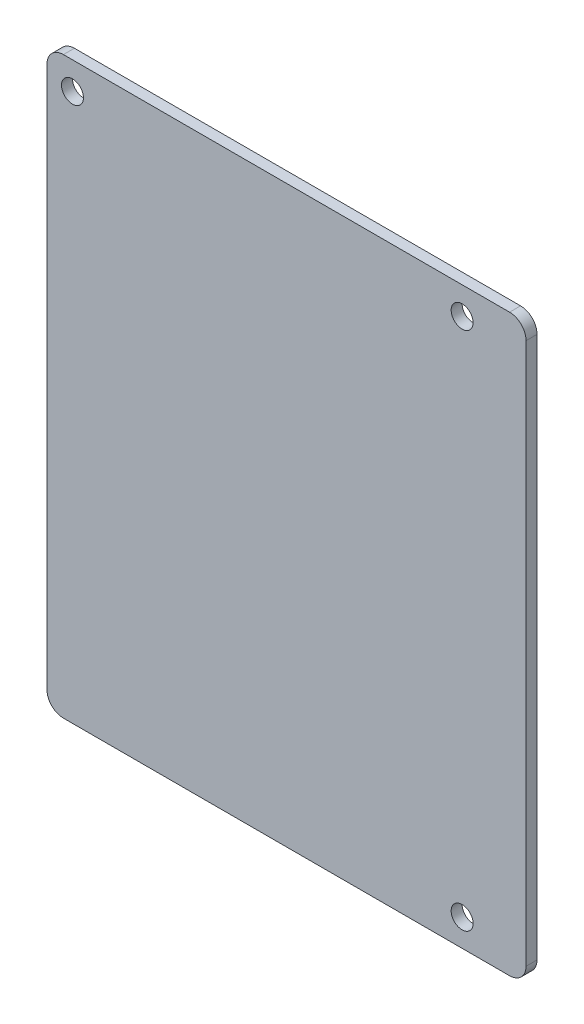
ISO-10303-21;
HEADER;
FILE_DESCRIPTION(('STEP AP214'),'2;1');
FILE_NAME('part.step','',(''),(''),'','','');
FILE_SCHEMA(('AUTOMOTIVE_DESIGN { 1 0 10303 214 1 1 1 1 }'));
ENDSEC;
DATA;
#1=APPLICATION_CONTEXT('core data for automotive mechanical design processes');
#2=APPLICATION_PROTOCOL_DEFINITION('international standard','automotive_design',2000,#1);
#3=PRODUCT_CONTEXT('',#1,'mechanical');
#4=PRODUCT('Part','Part','',(#3));
#5=PRODUCT_RELATED_PRODUCT_CATEGORY('part','',(#4));
#6=PRODUCT_DEFINITION_FORMATION('','',#4);
#7=PRODUCT_DEFINITION_CONTEXT('part definition',#1,'design');
#8=PRODUCT_DEFINITION('design','',#6,#7);
#9=PRODUCT_DEFINITION_SHAPE('','',#8);
#10=(LENGTH_UNIT() NAMED_UNIT(*) SI_UNIT(.MILLI.,.METRE.));
#11=(NAMED_UNIT(*) PLANE_ANGLE_UNIT() SI_UNIT($,.RADIAN.));
#12=(NAMED_UNIT(*) SI_UNIT($,.STERADIAN.) SOLID_ANGLE_UNIT());
#13=UNCERTAINTY_MEASURE_WITH_UNIT(LENGTH_MEASURE(1.E-05),#10,'distance_accuracy_value','');
#14=(GEOMETRIC_REPRESENTATION_CONTEXT(3) GLOBAL_UNCERTAINTY_ASSIGNED_CONTEXT((#13)) GLOBAL_UNIT_ASSIGNED_CONTEXT((#10,
#11,#12)) REPRESENTATION_CONTEXT('',''));
#15=CARTESIAN_POINT('',(0.,0.,0.));
#16=DIRECTION('',(0.,0.,1.));
#17=DIRECTION('',(1.,0.,0.));
#18=AXIS2_PLACEMENT_3D('',#15,#16,#17);
#19=CARTESIAN_POINT('',(-40.65,-49.36,2.));
#20=DIRECTION('',(0.,0.,-1.));
#21=DIRECTION('',(-1.,0.,0.));
#22=AXIS2_PLACEMENT_3D('',#19,#20,#21);
#23=CYLINDRICAL_SURFACE('',#22,3.);
#24=CARTESIAN_POINT('',(-40.65,-49.36,0.));
#25=DIRECTION('',(0.,0.,1.));
#26=DIRECTION('',(-1.,0.,0.));
#27=AXIS2_PLACEMENT_3D('',#24,#25,#26);
#28=CIRCLE('',#27,3.);
#29=CARTESIAN_POINT('',(-43.65,-49.36,0.));
#30=VERTEX_POINT('',#29);
#31=CARTESIAN_POINT('',(-40.65,-52.36,0.));
#32=VERTEX_POINT('',#31);
#33=EDGE_CURVE('E135',#30,#32,#28,.T.);
#34=ORIENTED_EDGE('',*,*,#33,.T.);
#35=DIRECTION('',(0.,0.,-1.));
#36=VECTOR('',#35,1.);
#37=CARTESIAN_POINT('',(-40.65,-52.36,2.));
#38=LINE('',#37,#36);
#39=CARTESIAN_POINT('',(-40.65,-52.36,2.));
#40=VERTEX_POINT('',#39);
#41=EDGE_CURVE('E11',#40,#32,#38,.T.);
#42=ORIENTED_EDGE('',*,*,#41,.F.);
#43=CARTESIAN_POINT('',(-40.65,-49.36,2.));
#44=DIRECTION('',(0.,0.,1.));
#45=DIRECTION('',(-1.,0.,0.));
#46=AXIS2_PLACEMENT_3D('',#43,#44,#45);
#47=CIRCLE('',#46,3.);
#48=CARTESIAN_POINT('',(-43.65,-49.36,2.));
#49=VERTEX_POINT('',#48);
#50=EDGE_CURVE('E150',#49,#40,#47,.T.);
#51=ORIENTED_EDGE('',*,*,#50,.F.);
#52=DIRECTION('',(0.,0.,-1.));
#53=VECTOR('',#52,1.);
#54=CARTESIAN_POINT('',(-43.65,-49.36,2.));
#55=LINE('',#54,#53);
#56=EDGE_CURVE('E131',#49,#30,#55,.T.);
#57=ORIENTED_EDGE('',*,*,#56,.T.);
#58=EDGE_LOOP('',(#34,#42,#51,#57));
#59=FACE_BOUND('',#58,.T.);
#60=ADVANCED_FACE('F39',(#59),#23,.T.);
#61=CARTESIAN_POINT('',(-40.65,-52.36,2.));
#62=DIRECTION('',(0.,1.,0.));
#63=DIRECTION('',(0.,0.,1.));
#64=AXIS2_PLACEMENT_3D('',#61,#62,#63);
#65=PLANE('',#64);
#66=DIRECTION('',(1.,0.,0.));
#67=VECTOR('',#66,1.);
#68=CARTESIAN_POINT('',(-40.65,-52.36,0.));
#69=LINE('',#68,#67);
#70=CARTESIAN_POINT('',(40.65,-52.36,0.));
#71=VERTEX_POINT('',#70);
#72=EDGE_CURVE('E138',#32,#71,#69,.T.);
#73=ORIENTED_EDGE('',*,*,#72,.T.);
#74=DIRECTION('',(0.,0.,-1.));
#75=VECTOR('',#74,1.);
#76=CARTESIAN_POINT('',(40.65,-52.36,2.));
#77=LINE('',#76,#75);
#78=CARTESIAN_POINT('',(40.65,-52.36,2.));
#79=VERTEX_POINT('',#78);
#80=EDGE_CURVE('E47',#79,#71,#77,.T.);
#81=ORIENTED_EDGE('',*,*,#80,.F.);
#82=DIRECTION('',(1.,0.,0.));
#83=VECTOR('',#82,1.);
#84=CARTESIAN_POINT('',(-40.65,-52.36,2.));
#85=LINE('',#84,#83);
#86=EDGE_CURVE('E98',#40,#79,#85,.T.);
#87=ORIENTED_EDGE('',*,*,#86,.F.);
#88=ORIENTED_EDGE('',*,*,#41,.T.);
#89=EDGE_LOOP('',(#73,#81,#87,#88));
#90=FACE_BOUND('',#89,.T.);
#91=ADVANCED_FACE('F226',(#90),#65,.F.);
#92=CARTESIAN_POINT('',(40.65,-49.36,2.));
#93=DIRECTION('',(0.,0.,-1.));
#94=DIRECTION('',(-1.,0.,0.));
#95=AXIS2_PLACEMENT_3D('',#92,#93,#94);
#96=CYLINDRICAL_SURFACE('',#95,3.00000000000001);
#97=CARTESIAN_POINT('',(40.65,-49.36,0.));
#98=DIRECTION('',(0.,0.,1.));
#99=DIRECTION('',(-1.,0.,0.));
#100=AXIS2_PLACEMENT_3D('',#97,#98,#99);
#101=CIRCLE('',#100,3.00000000000001);
#102=CARTESIAN_POINT('',(43.65,-49.36,0.));
#103=VERTEX_POINT('',#102);
#104=EDGE_CURVE('E141',#71,#103,#101,.T.);
#105=ORIENTED_EDGE('',*,*,#104,.T.);
#106=DIRECTION('',(0.,0.,-1.));
#107=VECTOR('',#106,1.);
#108=CARTESIAN_POINT('',(43.65,-49.36,2.));
#109=LINE('',#108,#107);
#110=CARTESIAN_POINT('',(43.65,-49.36,2.));
#111=VERTEX_POINT('',#110);
#112=EDGE_CURVE('E157',#111,#103,#109,.T.);
#113=ORIENTED_EDGE('',*,*,#112,.F.);
#114=CARTESIAN_POINT('',(40.65,-49.36,2.));
#115=DIRECTION('',(0.,0.,1.));
#116=DIRECTION('',(-1.,0.,0.));
#117=AXIS2_PLACEMENT_3D('',#114,#115,#116);
#118=CIRCLE('',#117,3.00000000000001);
#119=EDGE_CURVE('E165',#79,#111,#118,.T.);
#120=ORIENTED_EDGE('',*,*,#119,.F.);
#121=ORIENTED_EDGE('',*,*,#80,.T.);
#122=EDGE_LOOP('',(#105,#113,#120,#121));
#123=FACE_BOUND('',#122,.T.);
#124=ADVANCED_FACE('F163',(#123),#96,.T.);
#125=CARTESIAN_POINT('',(43.65,49.36,2.));
#126=DIRECTION('',(-1.,0.,0.));
#127=DIRECTION('',(0.,-1.,0.));
#128=AXIS2_PLACEMENT_3D('',#125,#126,#127);
#129=PLANE('',#128);
#130=DIRECTION('',(0.,1.,0.));
#131=VECTOR('',#130,1.);
#132=CARTESIAN_POINT('',(43.65,49.36,0.));
#133=LINE('',#132,#131);
#134=CARTESIAN_POINT('',(43.65,49.36,0.));
#135=VERTEX_POINT('',#134);
#136=EDGE_CURVE('E143',#103,#135,#133,.T.);
#137=ORIENTED_EDGE('',*,*,#136,.T.);
#138=DIRECTION('',(0.,0.,-1.));
#139=VECTOR('',#138,1.);
#140=CARTESIAN_POINT('',(43.65,49.36,2.));
#141=LINE('',#140,#139);
#142=CARTESIAN_POINT('',(43.65,49.36,2.));
#143=VERTEX_POINT('',#142);
#144=EDGE_CURVE('E154',#143,#135,#141,.T.);
#145=ORIENTED_EDGE('',*,*,#144,.F.);
#146=DIRECTION('',(0.,1.,0.));
#147=VECTOR('',#146,1.);
#148=CARTESIAN_POINT('',(43.65,49.36,2.));
#149=LINE('',#148,#147);
#150=EDGE_CURVE('E177',#111,#143,#149,.T.);
#151=ORIENTED_EDGE('',*,*,#150,.F.);
#152=ORIENTED_EDGE('',*,*,#112,.T.);
#153=EDGE_LOOP('',(#137,#145,#151,#152));
#154=FACE_BOUND('',#153,.T.);
#155=ADVANCED_FACE('F173',(#154),#129,.F.);
#156=CARTESIAN_POINT('',(40.65,49.36,2.));
#157=DIRECTION('',(0.,0.,-1.));
#158=DIRECTION('',(-1.,0.,0.));
#159=AXIS2_PLACEMENT_3D('',#156,#157,#158);
#160=CYLINDRICAL_SURFACE('',#159,3.);
#161=CARTESIAN_POINT('',(40.65,49.36,0.));
#162=DIRECTION('',(0.,0.,1.));
#163=DIRECTION('',(-1.,0.,0.));
#164=AXIS2_PLACEMENT_3D('',#161,#162,#163);
#165=CIRCLE('',#164,3.);
#166=CARTESIAN_POINT('',(40.65,52.36,0.));
#167=VERTEX_POINT('',#166);
#168=EDGE_CURVE('E145',#135,#167,#165,.T.);
#169=ORIENTED_EDGE('',*,*,#168,.T.);
#170=DIRECTION('',(0.,0.,-1.));
#171=VECTOR('',#170,1.);
#172=CARTESIAN_POINT('',(40.65,52.36,2.));
#173=LINE('',#172,#171);
#174=CARTESIAN_POINT('',(40.65,52.36,2.));
#175=VERTEX_POINT('',#174);
#176=EDGE_CURVE('E126',#175,#167,#173,.T.);
#177=ORIENTED_EDGE('',*,*,#176,.F.);
#178=CARTESIAN_POINT('',(40.65,49.36,2.));
#179=DIRECTION('',(0.,0.,1.));
#180=DIRECTION('',(-1.,0.,0.));
#181=AXIS2_PLACEMENT_3D('',#178,#179,#180);
#182=CIRCLE('',#181,3.);
#183=EDGE_CURVE('E117',#143,#175,#182,.T.);
#184=ORIENTED_EDGE('',*,*,#183,.F.);
#185=ORIENTED_EDGE('',*,*,#144,.T.);
#186=EDGE_LOOP('',(#169,#177,#184,#185));
#187=FACE_BOUND('',#186,.T.);
#188=ADVANCED_FACE('F176',(#187),#160,.T.);
#189=CARTESIAN_POINT('',(-40.65,52.36,2.));
#190=DIRECTION('',(0.,-1.,0.));
#191=DIRECTION('',(0.,0.,-1.));
#192=AXIS2_PLACEMENT_3D('',#189,#190,#191);
#193=PLANE('',#192);
#194=DIRECTION('',(-1.,0.,0.));
#195=VECTOR('',#194,1.);
#196=CARTESIAN_POINT('',(-40.65,52.36,0.));
#197=LINE('',#196,#195);
#198=CARTESIAN_POINT('',(-40.65,52.36,0.));
#199=VERTEX_POINT('',#198);
#200=EDGE_CURVE('E125',#167,#199,#197,.T.);
#201=ORIENTED_EDGE('',*,*,#200,.T.);
#202=DIRECTION('',(0.,0.,-1.));
#203=VECTOR('',#202,1.);
#204=CARTESIAN_POINT('',(-40.65,52.36,2.));
#205=LINE('',#204,#203);
#206=CARTESIAN_POINT('',(-40.65,52.36,2.));
#207=VERTEX_POINT('',#206);
#208=EDGE_CURVE('E122',#207,#199,#205,.T.);
#209=ORIENTED_EDGE('',*,*,#208,.F.);
#210=DIRECTION('',(-1.,0.,0.));
#211=VECTOR('',#210,1.);
#212=CARTESIAN_POINT('',(-40.65,52.36,2.));
#213=LINE('',#212,#211);
#214=EDGE_CURVE('E111',#175,#207,#213,.T.);
#215=ORIENTED_EDGE('',*,*,#214,.F.);
#216=ORIENTED_EDGE('',*,*,#176,.T.);
#217=EDGE_LOOP('',(#201,#209,#215,#216));
#218=FACE_BOUND('',#217,.T.);
#219=ADVANCED_FACE('F123',(#218),#193,.F.);
#220=CARTESIAN_POINT('',(-40.65,49.36,2.));
#221=DIRECTION('',(0.,0.,-1.));
#222=DIRECTION('',(-1.,0.,0.));
#223=AXIS2_PLACEMENT_3D('',#220,#221,#222);
#224=CYLINDRICAL_SURFACE('',#223,3.);
#225=CARTESIAN_POINT('',(-40.65,49.36,0.));
#226=DIRECTION('',(0.,0.,1.));
#227=DIRECTION('',(1.,0.,0.));
#228=AXIS2_PLACEMENT_3D('',#225,#226,#227);
#229=CIRCLE('',#228,3.);
#230=CARTESIAN_POINT('',(-43.65,49.36,0.));
#231=VERTEX_POINT('',#230);
#232=EDGE_CURVE('E84',#199,#231,#229,.T.);
#233=ORIENTED_EDGE('',*,*,#232,.T.);
#234=DIRECTION('',(0.,0.,-1.));
#235=VECTOR('',#234,1.);
#236=CARTESIAN_POINT('',(-43.65,49.36,2.));
#237=LINE('',#236,#235);
#238=CARTESIAN_POINT('',(-43.65,49.36,2.));
#239=VERTEX_POINT('',#238);
#240=EDGE_CURVE('E127',#239,#231,#237,.T.);
#241=ORIENTED_EDGE('',*,*,#240,.F.);
#242=CARTESIAN_POINT('',(-40.65,49.36,2.));
#243=DIRECTION('',(0.,0.,1.));
#244=DIRECTION('',(1.,0.,0.));
#245=AXIS2_PLACEMENT_3D('',#242,#243,#244);
#246=CIRCLE('',#245,3.);
#247=EDGE_CURVE('E115',#207,#239,#246,.T.);
#248=ORIENTED_EDGE('',*,*,#247,.F.);
#249=ORIENTED_EDGE('',*,*,#208,.T.);
#250=EDGE_LOOP('',(#233,#241,#248,#249));
#251=FACE_BOUND('',#250,.T.);
#252=ADVANCED_FACE('F129',(#251),#224,.T.);
#253=CARTESIAN_POINT('',(-43.65,49.36,2.));
#254=DIRECTION('',(1.,0.,0.));
#255=DIRECTION('',(0.,1.,0.));
#256=AXIS2_PLACEMENT_3D('',#253,#254,#255);
#257=PLANE('',#256);
#258=DIRECTION('',(0.,-1.,0.));
#259=VECTOR('',#258,1.);
#260=CARTESIAN_POINT('',(-43.65,49.36,0.));
#261=LINE('',#260,#259);
#262=EDGE_CURVE('E90',#231,#30,#261,.T.);
#263=ORIENTED_EDGE('',*,*,#262,.T.);
#264=ORIENTED_EDGE('',*,*,#56,.F.);
#265=DIRECTION('',(0.,-1.,0.));
#266=VECTOR('',#265,1.);
#267=CARTESIAN_POINT('',(-43.65,49.36,2.));
#268=LINE('',#267,#266);
#269=EDGE_CURVE('E55',#239,#49,#268,.T.);
#270=ORIENTED_EDGE('',*,*,#269,.F.);
#271=ORIENTED_EDGE('',*,*,#240,.T.);
#272=EDGE_LOOP('',(#263,#264,#270,#271));
#273=FACE_BOUND('',#272,.T.);
#274=ADVANCED_FACE('F205',(#273),#257,.F.);
#275=CARTESIAN_POINT('',(-40.65,-49.36,2.));
#276=DIRECTION('',(0.,0.,-1.));
#277=DIRECTION('',(-1.,0.,0.));
#278=AXIS2_PLACEMENT_3D('',#275,#276,#277);
#279=PLANE('',#278);
#280=CARTESIAN_POINT('',(-39.,47.36,2.));
#281=DIRECTION('',(0.,0.,1.));
#282=DIRECTION('',(1.,0.,0.));
#283=AXIS2_PLACEMENT_3D('',#280,#281,#282);
#284=CIRCLE('',#283,1.99999999999999);
#285=CARTESIAN_POINT('',(-37.,47.36,2.));
#286=VERTEX_POINT('',#285);
#287=EDGE_CURVE('E197',#286,#286,#284,.T.);
#288=ORIENTED_EDGE('',*,*,#287,.F.);
#289=EDGE_LOOP('',(#288));
#290=FACE_BOUND('',#289,.T.);
#291=CARTESIAN_POINT('',(32.,47.36,2.));
#292=DIRECTION('',(0.,0.,1.));
#293=DIRECTION('',(1.,0.,0.));
#294=AXIS2_PLACEMENT_3D('',#291,#292,#293);
#295=CIRCLE('',#294,1.99999999999999);
#296=CARTESIAN_POINT('',(34.,47.36,2.));
#297=VERTEX_POINT('',#296);
#298=EDGE_CURVE('E191',#297,#297,#295,.T.);
#299=ORIENTED_EDGE('',*,*,#298,.F.);
#300=EDGE_LOOP('',(#299));
#301=FACE_BOUND('',#300,.T.);
#302=CARTESIAN_POINT('',(32.,-47.44,2.));
#303=DIRECTION('',(0.,0.,1.));
#304=DIRECTION('',(1.,0.,0.));
#305=AXIS2_PLACEMENT_3D('',#302,#303,#304);
#306=CIRCLE('',#305,1.99999999999999);
#307=CARTESIAN_POINT('',(34.,-47.44,2.));
#308=VERTEX_POINT('',#307);
#309=EDGE_CURVE('E185',#308,#308,#306,.T.);
#310=ORIENTED_EDGE('',*,*,#309,.F.);
#311=EDGE_LOOP('',(#310));
#312=FACE_BOUND('',#311,.T.);
#313=ORIENTED_EDGE('',*,*,#50,.T.);
#314=ORIENTED_EDGE('',*,*,#86,.T.);
#315=ORIENTED_EDGE('',*,*,#119,.T.);
#316=ORIENTED_EDGE('',*,*,#150,.T.);
#317=ORIENTED_EDGE('',*,*,#183,.T.);
#318=ORIENTED_EDGE('',*,*,#214,.T.);
#319=ORIENTED_EDGE('',*,*,#247,.T.);
#320=ORIENTED_EDGE('',*,*,#269,.T.);
#321=EDGE_LOOP('',(#313,#314,#315,#316,#317,#318,#319,#320));
#322=FACE_BOUND('',#321,.T.);
#323=ADVANCED_FACE('F113',(#290,#301,#312,#322),#279,.F.);
#324=CARTESIAN_POINT('',(-40.65,-49.36,0.));
#325=DIRECTION('',(0.,0.,-1.));
#326=DIRECTION('',(-1.,0.,0.));
#327=AXIS2_PLACEMENT_3D('',#324,#325,#326);
#328=PLANE('',#327);
#329=CARTESIAN_POINT('',(-39.,47.36,0.));
#330=DIRECTION('',(0.,0.,1.));
#331=DIRECTION('',(1.,0.,0.));
#332=AXIS2_PLACEMENT_3D('',#329,#330,#331);
#333=CIRCLE('',#332,2.);
#334=CARTESIAN_POINT('',(-37.,47.36,0.));
#335=VERTEX_POINT('',#334);
#336=EDGE_CURVE('E194',#335,#335,#333,.T.);
#337=ORIENTED_EDGE('',*,*,#336,.T.);
#338=EDGE_LOOP('',(#337));
#339=FACE_BOUND('',#338,.T.);
#340=CARTESIAN_POINT('',(32.,47.36,0.));
#341=DIRECTION('',(0.,0.,1.));
#342=DIRECTION('',(1.,0.,0.));
#343=AXIS2_PLACEMENT_3D('',#340,#341,#342);
#344=CIRCLE('',#343,2.);
#345=CARTESIAN_POINT('',(34.,47.36,0.));
#346=VERTEX_POINT('',#345);
#347=EDGE_CURVE('E188',#346,#346,#344,.T.);
#348=ORIENTED_EDGE('',*,*,#347,.T.);
#349=EDGE_LOOP('',(#348));
#350=FACE_BOUND('',#349,.T.);
#351=CARTESIAN_POINT('',(32.,-47.44,0.));
#352=DIRECTION('',(0.,0.,1.));
#353=DIRECTION('',(1.,0.,0.));
#354=AXIS2_PLACEMENT_3D('',#351,#352,#353);
#355=CIRCLE('',#354,2.);
#356=CARTESIAN_POINT('',(34.,-47.44,0.));
#357=VERTEX_POINT('',#356);
#358=EDGE_CURVE('E139',#357,#357,#355,.T.);
#359=ORIENTED_EDGE('',*,*,#358,.T.);
#360=EDGE_LOOP('',(#359));
#361=FACE_BOUND('',#360,.T.);
#362=ORIENTED_EDGE('',*,*,#33,.F.);
#363=ORIENTED_EDGE('',*,*,#262,.F.);
#364=ORIENTED_EDGE('',*,*,#232,.F.);
#365=ORIENTED_EDGE('',*,*,#200,.F.);
#366=ORIENTED_EDGE('',*,*,#168,.F.);
#367=ORIENTED_EDGE('',*,*,#136,.F.);
#368=ORIENTED_EDGE('',*,*,#104,.F.);
#369=ORIENTED_EDGE('',*,*,#72,.F.);
#370=EDGE_LOOP('',(#362,#363,#364,#365,#366,#367,#368,#369));
#371=FACE_BOUND('',#370,.T.);
#372=ADVANCED_FACE('F169',(#339,#350,#361,#371),#328,.T.);
#373=CARTESIAN_POINT('',(32.,-47.44,2.));
#374=DIRECTION('',(0.,0.,1.));
#375=DIRECTION('',(1.,0.,0.));
#376=AXIS2_PLACEMENT_3D('',#373,#374,#375);
#377=CYLINDRICAL_SURFACE('',#376,1.99999999999999);
#378=ORIENTED_EDGE('',*,*,#358,.F.);
#379=EDGE_LOOP('',(#378));
#380=FACE_BOUND('',#379,.T.);
#381=ORIENTED_EDGE('',*,*,#309,.T.);
#382=EDGE_LOOP('',(#381));
#383=FACE_BOUND('',#382,.T.);
#384=ADVANCED_FACE('F211',(#380,#383),#377,.F.);
#385=CARTESIAN_POINT('',(32.,47.36,2.));
#386=DIRECTION('',(0.,0.,1.));
#387=DIRECTION('',(1.,0.,0.));
#388=AXIS2_PLACEMENT_3D('',#385,#386,#387);
#389=CYLINDRICAL_SURFACE('',#388,1.99999999999999);
#390=ORIENTED_EDGE('',*,*,#347,.F.);
#391=EDGE_LOOP('',(#390));
#392=FACE_BOUND('',#391,.T.);
#393=ORIENTED_EDGE('',*,*,#298,.T.);
#394=EDGE_LOOP('',(#393));
#395=FACE_BOUND('',#394,.T.);
#396=ADVANCED_FACE('F213',(#392,#395),#389,.F.);
#397=CARTESIAN_POINT('',(-39.,47.36,2.));
#398=DIRECTION('',(0.,0.,1.));
#399=DIRECTION('',(1.,0.,0.));
#400=AXIS2_PLACEMENT_3D('',#397,#398,#399);
#401=CYLINDRICAL_SURFACE('',#400,1.99999999999999);
#402=ORIENTED_EDGE('',*,*,#336,.F.);
#403=EDGE_LOOP('',(#402));
#404=FACE_BOUND('',#403,.T.);
#405=ORIENTED_EDGE('',*,*,#287,.T.);
#406=EDGE_LOOP('',(#405));
#407=FACE_BOUND('',#406,.T.);
#408=ADVANCED_FACE('F201',(#404,#407),#401,.F.);
#409=CLOSED_SHELL('',(#60,#91,#124,#155,#188,#219,#252,#274,#323,#372,#384,#396,#408));
#410=MANIFOLD_SOLID_BREP('B2',#409);
#411=ADVANCED_BREP_SHAPE_REPRESENTATION('',(#18,#410),#14);
#412=SHAPE_DEFINITION_REPRESENTATION(#9,#411);
ENDSEC;
END-ISO-10303-21;
